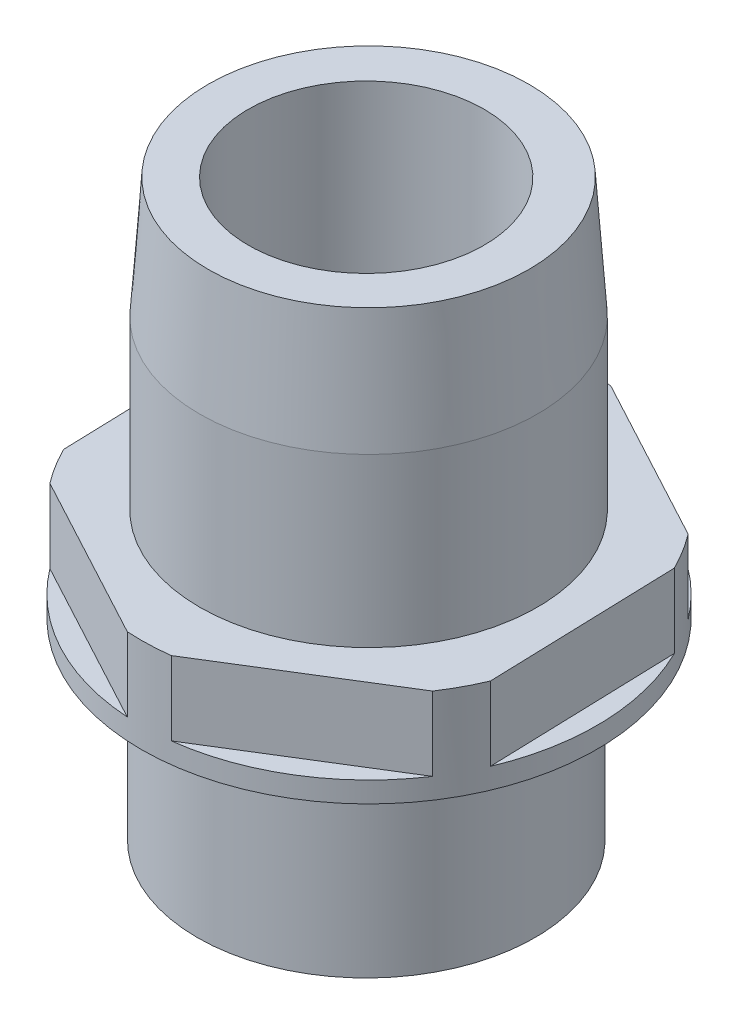
ISO-10303-21;
HEADER;
FILE_DESCRIPTION(('STEP AP214'),'2;1');
FILE_NAME('part.step','',(''),(''),'','','');
FILE_SCHEMA(('AUTOMOTIVE_DESIGN { 1 0 10303 214 1 1 1 1 }'));
ENDSEC;
DATA;
#1=APPLICATION_CONTEXT('core data for automotive mechanical design processes');
#2=APPLICATION_PROTOCOL_DEFINITION('international standard','automotive_design',2000,#1);
#3=PRODUCT_CONTEXT('',#1,'mechanical');
#4=PRODUCT('Part','Part','',(#3));
#5=PRODUCT_RELATED_PRODUCT_CATEGORY('part','',(#4));
#6=PRODUCT_DEFINITION_FORMATION('','',#4);
#7=PRODUCT_DEFINITION_CONTEXT('part definition',#1,'design');
#8=PRODUCT_DEFINITION('design','',#6,#7);
#9=PRODUCT_DEFINITION_SHAPE('','',#8);
#10=(LENGTH_UNIT() NAMED_UNIT(*) SI_UNIT(.MILLI.,.METRE.));
#11=(NAMED_UNIT(*) PLANE_ANGLE_UNIT() SI_UNIT($,.RADIAN.));
#12=(NAMED_UNIT(*) SI_UNIT($,.STERADIAN.) SOLID_ANGLE_UNIT());
#13=UNCERTAINTY_MEASURE_WITH_UNIT(LENGTH_MEASURE(1.E-05),#10,'distance_accuracy_value','');
#14=(GEOMETRIC_REPRESENTATION_CONTEXT(3) GLOBAL_UNCERTAINTY_ASSIGNED_CONTEXT((#13)) GLOBAL_UNIT_ASSIGNED_CONTEXT((#10,
#11,#12)) REPRESENTATION_CONTEXT('',''));
#15=CARTESIAN_POINT('',(0.,0.,0.));
#16=DIRECTION('',(0.,0.,1.));
#17=DIRECTION('',(1.,0.,0.));
#18=AXIS2_PLACEMENT_3D('',#15,#16,#17);
#19=CARTESIAN_POINT('',(-14.328841801714,1.651,-9.16255151509777));
#20=DIRECTION('',(0.,1.,0.));
#21=DIRECTION('',(0.,0.,1.));
#22=AXIS2_PLACEMENT_3D('',#19,#20,#21);
#23=PLANE('',#22);
#24=DIRECTION('',(0.850222544988236,0.,-0.526423426524436));
#25=VECTOR('',#24,1.);
#26=CARTESIAN_POINT('',(-13.7419573430785,1.651,9.89251867541965));
#27=LINE('',#26,#25);
#28=CARTESIAN_POINT('',(-12.0702323694104,1.651,8.85745415727396));
#29=VERTEX_POINT('',#28);
#30=CARTESIAN_POINT('',(0.795050309819294,1.651,0.891791248042038));
#31=VERTEX_POINT('',#30);
#32=EDGE_CURVE('E44',#29,#31,#27,.T.);
#33=ORIENTED_EDGE('',*,*,#32,.F.);
#34=CARTESIAN_POINT('',(-14.328841801714,1.651,-9.16255151509777));
#35=DIRECTION('',(0.,1.,0.));
#36=DIRECTION('',(0.,0.,1.));
#37=AXIS2_PLACEMENT_3D('',#34,#35,#36);
#38=CIRCLE('',#37,18.161);
#39=EDGE_CURVE('E173',#29,#31,#38,.T.);
#40=ORIENTED_EDGE('',*,*,#39,.T.);
#41=EDGE_LOOP('',(#33,#40));
#42=FACE_BOUND('',#41,.T.);
#43=ADVANCED_FACE('F36',(#42),#23,.T.);
#44=DIRECTION('',(0.88100733301153,0.,0.473102609567852));
#45=VECTOR('',#44,1.);
#46=CARTESIAN_POINT('',(-30.5375744282799,1.651,0.873240430425529));
#47=LINE('',#46,#45);
#48=CARTESIAN_POINT('',(-28.8053197741758,1.651,1.80346446669015));
#49=VERTEX_POINT('',#48);
#50=CARTESIAN_POINT('',(-15.4742119971826,1.651,8.96229463915502));
#51=VERTEX_POINT('',#50);
#52=EDGE_CURVE('E168',#49,#51,#47,.T.);
#53=ORIENTED_EDGE('',*,*,#52,.F.);
#54=EDGE_CURVE('E185',#49,#51,#38,.T.);
#55=ORIENTED_EDGE('',*,*,#54,.T.);
#56=EDGE_LOOP('',(#53,#55));
#57=FACE_BOUND('',#56,.T.);
#58=ADVANCED_FACE('F251',(#57),#23,.T.);
#59=DIRECTION('',(0.0307847880232944,0.,0.999526036092288));
#60=VECTOR('',#59,1.);
#61=CARTESIAN_POINT('',(-31.1244588869154,1.651,-18.1818297600919));
#62=LINE('',#61,#60);
#63=CARTESIAN_POINT('',(-31.0639292064794,1.651,-16.2165412056816));
#64=VERTEX_POINT('',#63);
#65=CARTESIAN_POINT('',(-30.5981041087159,1.651,-1.09204812398479));
#66=VERTEX_POINT('',#65);
#67=EDGE_CURVE('E179',#64,#66,#62,.T.);
#68=ORIENTED_EDGE('',*,*,#67,.F.);
#69=EDGE_CURVE('E189',#64,#66,#38,.T.);
#70=ORIENTED_EDGE('',*,*,#69,.T.);
#71=EDGE_LOOP('',(#68,#70));
#72=FACE_BOUND('',#71,.T.);
#73=ADVANCED_FACE('F256',(#72),#23,.T.);
#74=DIRECTION('',(-0.850222544988235,0.,0.526423426524436));
#75=VECTOR('',#74,1.);
#76=CARTESIAN_POINT('',(-14.9157262603494,1.651,-28.2176217056152));
#77=LINE('',#76,#75);
#78=CARTESIAN_POINT('',(-16.5874512340176,1.651,-27.1825571874695));
#79=VERTEX_POINT('',#78);
#80=CARTESIAN_POINT('',(-29.4527339132472,1.651,-19.2168942782376));
#81=VERTEX_POINT('',#80);
#82=EDGE_CURVE('E176',#79,#81,#77,.T.);
#83=ORIENTED_EDGE('',*,*,#82,.F.);
#84=EDGE_CURVE('E194',#79,#81,#38,.T.);
#85=ORIENTED_EDGE('',*,*,#84,.T.);
#86=EDGE_LOOP('',(#83,#85));
#87=FACE_BOUND('',#86,.T.);
#88=ADVANCED_FACE('F267',(#87),#23,.T.);
#89=DIRECTION('',(-0.88100733301153,0.,-0.473102609567852));
#90=VECTOR('',#89,1.);
#91=CARTESIAN_POINT('',(1.87989082485196,1.651,-19.1983434606211));
#92=LINE('',#91,#90);
#93=CARTESIAN_POINT('',(0.147636170747839,1.651,-20.1285674968857));
#94=VERTEX_POINT('',#93);
#95=CARTESIAN_POINT('',(-13.1834716062453,1.651,-27.2873976693506));
#96=VERTEX_POINT('',#95);
#97=EDGE_CURVE('E172',#94,#96,#92,.T.);
#98=ORIENTED_EDGE('',*,*,#97,.F.);
#99=EDGE_CURVE('E199',#94,#96,#38,.T.);
#100=ORIENTED_EDGE('',*,*,#99,.T.);
#101=EDGE_LOOP('',(#98,#100));
#102=FACE_BOUND('',#101,.T.);
#103=ADVANCED_FACE('F260',(#102),#23,.T.);
#104=CARTESIAN_POINT('',(-14.328841801714,1.651,-9.16255151509777));
#105=DIRECTION('',(0.,-1.,0.));
#106=DIRECTION('',(0.,0.,-1.));
#107=AXIS2_PLACEMENT_3D('',#104,#105,#106);
#108=CYLINDRICAL_SURFACE('',#107,18.161);
#109=ORIENTED_EDGE('',*,*,#39,.F.);
#110=DIRECTION('',(0.,1.,0.));
#111=VECTOR('',#110,1.);
#112=CARTESIAN_POINT('',(-12.0702323694104,-0.00100000000000013,8.85745415727396));
#113=LINE('',#112,#111);
#114=CARTESIAN_POINT('',(-12.0702323694104,7.5438,8.85745415727396));
#115=VERTEX_POINT('',#114);
#116=EDGE_CURVE('E234',#29,#115,#113,.T.);
#117=ORIENTED_EDGE('',*,*,#116,.T.);
#118=CARTESIAN_POINT('',(-14.328841801714,7.5438,-9.16255151509777));
#119=DIRECTION('',(0.,-1.,0.));
#120=DIRECTION('',(0.,0.,1.));
#121=AXIS2_PLACEMENT_3D('',#118,#119,#120);
#122=CIRCLE('',#121,18.161);
#123=CARTESIAN_POINT('',(-15.4742119971826,7.5438,8.96229463915502));
#124=VERTEX_POINT('',#123);
#125=EDGE_CURVE('E146',#115,#124,#122,.T.);
#126=ORIENTED_EDGE('',*,*,#125,.T.);
#127=DIRECTION('',(0.,1.,0.));
#128=VECTOR('',#127,1.);
#129=CARTESIAN_POINT('',(-15.4742119971826,-0.00100000000000013,8.96229463915502));
#130=LINE('',#129,#128);
#131=EDGE_CURVE('E229',#51,#124,#130,.T.);
#132=ORIENTED_EDGE('',*,*,#131,.F.);
#133=ORIENTED_EDGE('',*,*,#54,.F.);
#134=DIRECTION('',(0.,1.,0.));
#135=VECTOR('',#134,1.);
#136=CARTESIAN_POINT('',(-28.8053197741758,-0.00100000000000013,1.80346446669015));
#137=LINE('',#136,#135);
#138=CARTESIAN_POINT('',(-28.8053197741758,7.5438,1.80346446669015));
#139=VERTEX_POINT('',#138);
#140=EDGE_CURVE('E228',#49,#139,#137,.T.);
#141=ORIENTED_EDGE('',*,*,#140,.T.);
#142=CARTESIAN_POINT('',(-14.328841801714,7.5438,-9.16255151509777));
#143=DIRECTION('',(0.,-1.,0.));
#144=DIRECTION('',(0.,0.,1.));
#145=AXIS2_PLACEMENT_3D('',#142,#143,#144);
#146=CIRCLE('',#145,18.161);
#147=CARTESIAN_POINT('',(-30.5981041087159,7.5438,-1.09204812398479));
#148=VERTEX_POINT('',#147);
#149=EDGE_CURVE('E226',#139,#148,#146,.T.);
#150=ORIENTED_EDGE('',*,*,#149,.T.);
#151=DIRECTION('',(0.,1.,0.));
#152=VECTOR('',#151,1.);
#153=CARTESIAN_POINT('',(-30.5981041087159,-0.00100000000000013,-1.09204812398479));
#154=LINE('',#153,#152);
#155=EDGE_CURVE('E222',#66,#148,#154,.T.);
#156=ORIENTED_EDGE('',*,*,#155,.F.);
#157=ORIENTED_EDGE('',*,*,#69,.F.);
#158=DIRECTION('',(0.,1.,0.));
#159=VECTOR('',#158,1.);
#160=CARTESIAN_POINT('',(-31.0639292064794,-0.00100000000000013,-16.2165412056816));
#161=LINE('',#160,#159);
#162=CARTESIAN_POINT('',(-31.0639292064794,7.5438,-16.2165412056816));
#163=VERTEX_POINT('',#162);
#164=EDGE_CURVE('E153',#64,#163,#161,.T.);
#165=ORIENTED_EDGE('',*,*,#164,.T.);
#166=CARTESIAN_POINT('',(-14.328841801714,7.5438,-9.16255151509777));
#167=DIRECTION('',(0.,-1.,0.));
#168=DIRECTION('',(0.,0.,1.));
#169=AXIS2_PLACEMENT_3D('',#166,#167,#168);
#170=CIRCLE('',#169,18.161);
#171=CARTESIAN_POINT('',(-29.4527339132472,7.5438,-19.2168942782376));
#172=VERTEX_POINT('',#171);
#173=EDGE_CURVE('E141',#163,#172,#170,.T.);
#174=ORIENTED_EDGE('',*,*,#173,.T.);
#175=DIRECTION('',(0.,1.,0.));
#176=VECTOR('',#175,1.);
#177=CARTESIAN_POINT('',(-29.4527339132472,-0.00100000000000013,-19.2168942782376));
#178=LINE('',#177,#176);
#179=EDGE_CURVE('E148',#81,#172,#178,.T.);
#180=ORIENTED_EDGE('',*,*,#179,.F.);
#181=ORIENTED_EDGE('',*,*,#84,.F.);
#182=DIRECTION('',(0.,1.,0.));
#183=VECTOR('',#182,1.);
#184=CARTESIAN_POINT('',(-16.5874512340176,-0.00100000000000013,-27.1825571874695));
#185=LINE('',#184,#183);
#186=CARTESIAN_POINT('',(-16.5874512340176,7.5438,-27.1825571874695));
#187=VERTEX_POINT('',#186);
#188=EDGE_CURVE('E51',#79,#187,#185,.T.);
#189=ORIENTED_EDGE('',*,*,#188,.T.);
#190=CARTESIAN_POINT('',(-14.328841801714,7.5438,-9.16255151509777));
#191=DIRECTION('',(0.,-1.,0.));
#192=DIRECTION('',(0.,0.,1.));
#193=AXIS2_PLACEMENT_3D('',#190,#191,#192);
#194=CIRCLE('',#193,18.161);
#195=CARTESIAN_POINT('',(-13.1834716062453,7.5438,-27.2873976693506));
#196=VERTEX_POINT('',#195);
#197=EDGE_CURVE('E219',#187,#196,#194,.T.);
#198=ORIENTED_EDGE('',*,*,#197,.T.);
#199=DIRECTION('',(0.,1.,0.));
#200=VECTOR('',#199,1.);
#201=CARTESIAN_POINT('',(-13.1834716062453,-0.00100000000000013,-27.2873976693506));
#202=LINE('',#201,#200);
#203=EDGE_CURVE('E221',#96,#196,#202,.T.);
#204=ORIENTED_EDGE('',*,*,#203,.F.);
#205=ORIENTED_EDGE('',*,*,#99,.F.);
#206=DIRECTION('',(0.,1.,0.));
#207=VECTOR('',#206,1.);
#208=CARTESIAN_POINT('',(0.147636170747839,-0.00100000000000013,-20.1285674968857));
#209=LINE('',#208,#207);
#210=CARTESIAN_POINT('',(0.147636170747848,7.5438,-20.1285674968857));
#211=VERTEX_POINT('',#210);
#212=EDGE_CURVE('E58',#94,#211,#209,.T.);
#213=ORIENTED_EDGE('',*,*,#212,.T.);
#214=CARTESIAN_POINT('',(-14.328841801714,7.5438,-9.16255151509777));
#215=DIRECTION('',(0.,-1.,0.));
#216=DIRECTION('',(0.,0.,1.));
#217=AXIS2_PLACEMENT_3D('',#214,#215,#216);
#218=CIRCLE('',#217,18.161);
#219=CARTESIAN_POINT('',(1.94042050528796,7.5438,-17.2330549062108));
#220=VERTEX_POINT('',#219);
#221=EDGE_CURVE('E215',#211,#220,#218,.T.);
#222=ORIENTED_EDGE('',*,*,#221,.T.);
#223=DIRECTION('',(0.,1.,0.));
#224=VECTOR('',#223,1.);
#225=CARTESIAN_POINT('',(1.94042050528796,-0.00100000000000013,-17.2330549062108));
#226=LINE('',#225,#224);
#227=CARTESIAN_POINT('',(1.94042050528796,1.651,-17.2330549062108));
#228=VERTEX_POINT('',#227);
#229=EDGE_CURVE('E212',#228,#220,#226,.T.);
#230=ORIENTED_EDGE('',*,*,#229,.F.);
#231=CARTESIAN_POINT('',(2.40624560305143,1.651,-2.10856182451398));
#232=VERTEX_POINT('',#231);
#233=EDGE_CURVE('E184',#232,#228,#38,.T.);
#234=ORIENTED_EDGE('',*,*,#233,.F.);
#235=DIRECTION('',(0.,1.,0.));
#236=VECTOR('',#235,1.);
#237=CARTESIAN_POINT('',(2.40624560305143,-0.00100000000000013,-2.10856182451398));
#238=LINE('',#237,#236);
#239=CARTESIAN_POINT('',(2.40624560305142,7.5438,-2.10856182451398));
#240=VERTEX_POINT('',#239);
#241=EDGE_CURVE('E129',#232,#240,#238,.T.);
#242=ORIENTED_EDGE('',*,*,#241,.T.);
#243=CARTESIAN_POINT('',(-14.328841801714,7.5438,-9.16255151509777));
#244=DIRECTION('',(0.,-1.,0.));
#245=DIRECTION('',(0.,0.,1.));
#246=AXIS2_PLACEMENT_3D('',#243,#244,#245);
#247=CIRCLE('',#246,18.161);
#248=CARTESIAN_POINT('',(0.795050309819294,7.5438,0.891791248042038));
#249=VERTEX_POINT('',#248);
#250=EDGE_CURVE('E122',#240,#249,#247,.T.);
#251=ORIENTED_EDGE('',*,*,#250,.T.);
#252=DIRECTION('',(0.,1.,0.));
#253=VECTOR('',#252,1.);
#254=CARTESIAN_POINT('',(0.795050309819294,-0.00100000000000013,0.891791248042038));
#255=LINE('',#254,#253);
#256=EDGE_CURVE('E126',#31,#249,#255,.T.);
#257=ORIENTED_EDGE('',*,*,#256,.F.);
#258=EDGE_LOOP('',(#109,#117,#126,#132,#133,#141,#150,#156,#157,#165,#174,#180,#181,#189,#198,
#204,#205,#213,#222,#230,#234,#242,#251,#257));
#259=FACE_BOUND('',#258,.T.);
#260=CARTESIAN_POINT('',(-14.328841801714,0.,-9.16255151509777));
#261=DIRECTION('',(0.,1.,0.));
#262=DIRECTION('',(0.,0.,1.));
#263=AXIS2_PLACEMENT_3D('',#260,#261,#262);
#264=CIRCLE('',#263,18.161);
#265=CARTESIAN_POINT('',(-14.328841801714,0.,8.99844848490223));
#266=VERTEX_POINT('',#265);
#267=EDGE_CURVE('E166',#266,#266,#264,.T.);
#268=ORIENTED_EDGE('',*,*,#267,.T.);
#269=EDGE_LOOP('',(#268));
#270=FACE_BOUND('',#269,.T.);
#271=ADVANCED_FACE('F38',(#259,#270),#108,.T.);
#272=DIRECTION('',(-0.0307847880232945,0.,-0.999526036092288));
#273=VECTOR('',#272,1.);
#274=CARTESIAN_POINT('',(2.46677528348742,1.651,-0.143273270103649));
#275=LINE('',#274,#273);
#276=EDGE_CURVE('E169',#232,#228,#275,.T.);
#277=ORIENTED_EDGE('',*,*,#276,.F.);
#278=ORIENTED_EDGE('',*,*,#233,.T.);
#279=EDGE_LOOP('',(#277,#278));
#280=FACE_BOUND('',#279,.T.);
#281=ADVANCED_FACE('F208',(#280),#23,.T.);
#282=CARTESIAN_POINT('',(-14.328841801714,0.,-9.16255151509777));
#283=DIRECTION('',(0.,1.,0.));
#284=DIRECTION('',(0.,0.,1.));
#285=AXIS2_PLACEMENT_3D('',#282,#283,#284);
#286=PLANE('',#285);
#287=CARTESIAN_POINT('',(-14.3394201503924,0.,-8.95073522414691));
#288=DIRECTION('',(0.,1.,0.));
#289=DIRECTION('',(0.,0.,1.));
#290=AXIS2_PLACEMENT_3D('',#287,#288,#289);
#291=CIRCLE('',#290,13.462);
#292=CARTESIAN_POINT('',(-14.3394201503924,0.,4.51126477585309));
#293=VERTEX_POINT('',#292);
#294=EDGE_CURVE('E11',#293,#293,#291,.F.);
#295=ORIENTED_EDGE('',*,*,#294,.F.);
#296=EDGE_LOOP('',(#295));
#297=FACE_BOUND('',#296,.T.);
#298=ORIENTED_EDGE('',*,*,#267,.F.);
#299=EDGE_LOOP('',(#298));
#300=FACE_BOUND('',#299,.T.);
#301=ADVANCED_FACE('F259',(#297,#300),#286,.F.);
#302=CARTESIAN_POINT('',(-13.7419573430785,7.5438,9.89251867541965));
#303=DIRECTION('',(-0.526423426524436,0.,-0.850222544988236));
#304=DIRECTION('',(-0.850222544988236,0.,0.526423426524436));
#305=AXIS2_PLACEMENT_3D('',#302,#303,#304);
#306=PLANE('',#305);
#307=ORIENTED_EDGE('',*,*,#32,.T.);
#308=ORIENTED_EDGE('',*,*,#256,.T.);
#309=DIRECTION('',(0.850222544988236,0.,-0.526423426524436));
#310=VECTOR('',#309,1.);
#311=CARTESIAN_POINT('',(-13.7419573430785,7.5438,9.89251867541965));
#312=LINE('',#311,#310);
#313=EDGE_CURVE('E139',#115,#249,#312,.T.);
#314=ORIENTED_EDGE('',*,*,#313,.F.);
#315=ORIENTED_EDGE('',*,*,#116,.F.);
#316=EDGE_LOOP('',(#307,#308,#314,#315));
#317=FACE_BOUND('',#316,.T.);
#318=ADVANCED_FACE('F138',(#317),#306,.F.);
#319=CARTESIAN_POINT('',(2.46677528348742,7.5438,-0.143273270103649));
#320=DIRECTION('',(-0.999526036092288,0.,0.0307847880232945));
#321=DIRECTION('',(0.0307847880232945,0.,0.999526036092288));
#322=AXIS2_PLACEMENT_3D('',#319,#320,#321);
#323=PLANE('',#322);
#324=DIRECTION('',(-0.0307847880232945,0.,-0.999526036092288));
#325=VECTOR('',#324,1.);
#326=CARTESIAN_POINT('',(2.46677528348742,7.5438,-0.143273270103649));
#327=LINE('',#326,#325);
#328=EDGE_CURVE('E147',#240,#220,#327,.T.);
#329=ORIENTED_EDGE('',*,*,#328,.F.);
#330=ORIENTED_EDGE('',*,*,#241,.F.);
#331=ORIENTED_EDGE('',*,*,#276,.T.);
#332=ORIENTED_EDGE('',*,*,#229,.T.);
#333=EDGE_LOOP('',(#329,#330,#331,#332));
#334=FACE_BOUND('',#333,.T.);
#335=ADVANCED_FACE('F211',(#334),#323,.F.);
#336=CARTESIAN_POINT('',(1.87989082485196,7.5438,-19.1983434606211));
#337=DIRECTION('',(-0.473102609567852,0.,0.88100733301153));
#338=DIRECTION('',(0.88100733301153,0.,0.473102609567852));
#339=AXIS2_PLACEMENT_3D('',#336,#337,#338);
#340=PLANE('',#339);
#341=DIRECTION('',(-0.88100733301153,0.,-0.473102609567852));
#342=VECTOR('',#341,1.);
#343=CARTESIAN_POINT('',(1.87989082485196,7.5438,-19.1983434606211));
#344=LINE('',#343,#342);
#345=EDGE_CURVE('E150',#211,#196,#344,.T.);
#346=ORIENTED_EDGE('',*,*,#345,.F.);
#347=ORIENTED_EDGE('',*,*,#212,.F.);
#348=ORIENTED_EDGE('',*,*,#97,.T.);
#349=ORIENTED_EDGE('',*,*,#203,.T.);
#350=EDGE_LOOP('',(#346,#347,#348,#349));
#351=FACE_BOUND('',#350,.T.);
#352=ADVANCED_FACE('F273',(#351),#340,.F.);
#353=CARTESIAN_POINT('',(-14.9157262603494,7.5438,-28.2176217056152));
#354=DIRECTION('',(0.526423426524436,0.,0.850222544988236));
#355=DIRECTION('',(0.850222544988236,0.,-0.526423426524436));
#356=AXIS2_PLACEMENT_3D('',#353,#354,#355);
#357=PLANE('',#356);
#358=DIRECTION('',(-0.850222544988235,0.,0.526423426524436));
#359=VECTOR('',#358,1.);
#360=CARTESIAN_POINT('',(-14.9157262603494,7.5438,-28.2176217056152));
#361=LINE('',#360,#359);
#362=EDGE_CURVE('E159',#187,#172,#361,.T.);
#363=ORIENTED_EDGE('',*,*,#362,.F.);
#364=ORIENTED_EDGE('',*,*,#188,.F.);
#365=ORIENTED_EDGE('',*,*,#82,.T.);
#366=ORIENTED_EDGE('',*,*,#179,.T.);
#367=EDGE_LOOP('',(#363,#364,#365,#366));
#368=FACE_BOUND('',#367,.T.);
#369=ADVANCED_FACE('F275',(#368),#357,.F.);
#370=CARTESIAN_POINT('',(-31.1244588869154,7.5438,-18.1818297600919));
#371=DIRECTION('',(0.999526036092288,0.,-0.0307847880232944));
#372=DIRECTION('',(-0.0307847880232944,0.,-0.999526036092288));
#373=AXIS2_PLACEMENT_3D('',#370,#371,#372);
#374=PLANE('',#373);
#375=ORIENTED_EDGE('',*,*,#67,.T.);
#376=ORIENTED_EDGE('',*,*,#155,.T.);
#377=DIRECTION('',(0.0307847880232944,0.,0.999526036092288));
#378=VECTOR('',#377,1.);
#379=CARTESIAN_POINT('',(-31.1244588869154,7.5438,-18.1818297600919));
#380=LINE('',#379,#378);
#381=EDGE_CURVE('E161',#163,#148,#380,.T.);
#382=ORIENTED_EDGE('',*,*,#381,.F.);
#383=ORIENTED_EDGE('',*,*,#164,.F.);
#384=EDGE_LOOP('',(#375,#376,#382,#383));
#385=FACE_BOUND('',#384,.T.);
#386=ADVANCED_FACE('F245',(#385),#374,.F.);
#387=CARTESIAN_POINT('',(-30.5375744282799,7.5438,0.873240430425529));
#388=DIRECTION('',(0.473102609567852,0.,-0.88100733301153));
#389=DIRECTION('',(-0.88100733301153,0.,-0.473102609567852));
#390=AXIS2_PLACEMENT_3D('',#387,#388,#389);
#391=PLANE('',#390);
#392=DIRECTION('',(0.88100733301153,0.,0.473102609567852));
#393=VECTOR('',#392,1.);
#394=CARTESIAN_POINT('',(-30.5375744282799,7.5438,0.873240430425529));
#395=LINE('',#394,#393);
#396=EDGE_CURVE('E164',#139,#124,#395,.T.);
#397=ORIENTED_EDGE('',*,*,#396,.F.);
#398=ORIENTED_EDGE('',*,*,#140,.F.);
#399=ORIENTED_EDGE('',*,*,#52,.T.);
#400=ORIENTED_EDGE('',*,*,#131,.T.);
#401=EDGE_LOOP('',(#397,#398,#399,#400));
#402=FACE_BOUND('',#401,.T.);
#403=ADVANCED_FACE('F248',(#402),#391,.F.);
#404=CARTESIAN_POINT('',(0.,7.5438,0.));
#405=DIRECTION('',(0.,1.,0.));
#406=DIRECTION('',(0.,0.,1.));
#407=AXIS2_PLACEMENT_3D('',#404,#405,#406);
#408=PLANE('',#407);
#409=CARTESIAN_POINT('',(-14.2739017730092,7.5438,-9.07381828501432));
#410=DIRECTION('',(0.,1.,0.));
#411=DIRECTION('',(0.,0.,1.));
#412=AXIS2_PLACEMENT_3D('',#409,#410,#411);
#413=CIRCLE('',#412,13.462);
#414=CARTESIAN_POINT('',(-14.2739017730092,7.5438,4.38818171498568));
#415=VERTEX_POINT('',#414);
#416=EDGE_CURVE('E511',#415,#415,#413,.T.);
#417=ORIENTED_EDGE('',*,*,#416,.F.);
#418=EDGE_LOOP('',(#417));
#419=FACE_BOUND('',#418,.T.);
#420=ORIENTED_EDGE('',*,*,#250,.F.);
#421=ORIENTED_EDGE('',*,*,#328,.T.);
#422=ORIENTED_EDGE('',*,*,#221,.F.);
#423=ORIENTED_EDGE('',*,*,#345,.T.);
#424=ORIENTED_EDGE('',*,*,#197,.F.);
#425=ORIENTED_EDGE('',*,*,#362,.T.);
#426=ORIENTED_EDGE('',*,*,#173,.F.);
#427=ORIENTED_EDGE('',*,*,#381,.T.);
#428=ORIENTED_EDGE('',*,*,#149,.F.);
#429=ORIENTED_EDGE('',*,*,#396,.T.);
#430=ORIENTED_EDGE('',*,*,#125,.F.);
#431=ORIENTED_EDGE('',*,*,#313,.T.);
#432=EDGE_LOOP('',(#420,#421,#422,#423,#424,#425,#426,#427,#428,#429,#430,#431));
#433=FACE_BOUND('',#432,.T.);
#434=ADVANCED_FACE('F144',(#419,#433),#408,.T.);
#435=CARTESIAN_POINT('',(-14.2739017730092,20.8788,-9.07381828501432));
#436=DIRECTION('',(0.,-1.,0.));
#437=DIRECTION('',(0.,0.,-1.));
#438=AXIS2_PLACEMENT_3D('',#435,#436,#437);
#439=CYLINDRICAL_SURFACE('',#438,13.462);
#440=CARTESIAN_POINT('',(-14.2739017730092,20.8788,-9.07381828501432));
#441=DIRECTION('',(0.,1.,0.));
#442=DIRECTION('',(0.,0.,1.));
#443=AXIS2_PLACEMENT_3D('',#440,#441,#442);
#444=CIRCLE('',#443,13.462);
#445=CARTESIAN_POINT('',(-14.2739017730092,20.8788,4.38818171498568));
#446=VERTEX_POINT('',#445);
#447=EDGE_CURVE('E235',#446,#446,#444,.T.);
#448=ORIENTED_EDGE('',*,*,#447,.F.);
#449=EDGE_LOOP('',(#448));
#450=FACE_BOUND('',#449,.T.);
#451=ORIENTED_EDGE('',*,*,#416,.T.);
#452=EDGE_LOOP('',(#451));
#453=FACE_BOUND('',#452,.T.);
#454=ADVANCED_FACE('F326',(#450,#453),#439,.T.);
#455=CARTESIAN_POINT('',(-14.2739017730092,20.8788,-9.07381828501432));
#456=DIRECTION('',(0.,-1.,0.));
#457=DIRECTION('',(0.,0.,1.));
#458=AXIS2_PLACEMENT_3D('',#455,#456,#457);
#459=CONICAL_SURFACE('',#458,13.462,0.0698131700797732);
#460=CARTESIAN_POINT('',(-14.2739017730092,30.5308,-9.07381828501432));
#461=DIRECTION('',(0.,1.,0.));
#462=DIRECTION('',(0.,0.,1.));
#463=AXIS2_PLACEMENT_3D('',#460,#461,#462);
#464=CIRCLE('',#463,12.7870664111212);
#465=CARTESIAN_POINT('',(-14.2739017730092,30.5308,3.71324812610691));
#466=VERTEX_POINT('',#465);
#467=EDGE_CURVE('E508',#466,#466,#464,.T.);
#468=ORIENTED_EDGE('',*,*,#467,.F.);
#469=EDGE_LOOP('',(#468));
#470=FACE_BOUND('',#469,.T.);
#471=ORIENTED_EDGE('',*,*,#447,.T.);
#472=EDGE_LOOP('',(#471));
#473=FACE_BOUND('',#472,.T.);
#474=ADVANCED_FACE('F338',(#470,#473),#459,.T.);
#475=CARTESIAN_POINT('',(-14.2739017730092,30.5308,-9.07381828501432));
#476=DIRECTION('',(0.,1.,0.));
#477=DIRECTION('',(0.,0.,1.));
#478=AXIS2_PLACEMENT_3D('',#475,#476,#477);
#479=PLANE('',#478);
#480=CARTESIAN_POINT('',(-14.3394201503924,30.5308,-8.95073522414691));
#481=DIRECTION('',(0.,-1.,0.));
#482=DIRECTION('',(0.,0.,-1.));
#483=AXIS2_PLACEMENT_3D('',#480,#481,#482);
#484=CIRCLE('',#483,9.398);
#485=CARTESIAN_POINT('',(-14.3394201503924,30.5308,-18.3487352241469));
#486=VERTEX_POINT('',#485);
#487=EDGE_CURVE('E498',#486,#486,#484,.T.);
#488=ORIENTED_EDGE('',*,*,#487,.T.);
#489=EDGE_LOOP('',(#488));
#490=FACE_BOUND('',#489,.T.);
#491=ORIENTED_EDGE('',*,*,#467,.T.);
#492=EDGE_LOOP('',(#491));
#493=FACE_BOUND('',#492,.T.);
#494=ADVANCED_FACE('F349',(#490,#493),#479,.T.);
#495=CARTESIAN_POINT('',(-14.3394201503924,-15.24,-8.95073522414691));
#496=DIRECTION('',(0.,1.,0.));
#497=DIRECTION('',(0.,0.,1.));
#498=AXIS2_PLACEMENT_3D('',#495,#496,#497);
#499=CYLINDRICAL_SURFACE('',#498,13.462);
#500=CARTESIAN_POINT('',(-14.3394201503924,-15.24,-8.95073522414691));
#501=DIRECTION('',(0.,-1.,0.));
#502=DIRECTION('',(0.,0.,-1.));
#503=AXIS2_PLACEMENT_3D('',#500,#501,#502);
#504=CIRCLE('',#503,13.462);
#505=CARTESIAN_POINT('',(-14.3394201503924,-15.24,4.51126477585309));
#506=VERTEX_POINT('',#505);
#507=EDGE_CURVE('E503',#506,#506,#504,.T.);
#508=CARTESIAN_POINT('',(-14.3394201503924,-15.24,4.51126477585309));
#509=CARTESIAN_POINT('',(-14.3394201503924,-15.08125,4.51126477585309));
#510=CARTESIAN_POINT('',(-14.3394201503924,-14.9225,4.51126477585309));
#511=CARTESIAN_POINT('',(-14.3394201503924,-14.605,4.51126477585309));
#512=CARTESIAN_POINT('',(-14.3394201503924,-14.44625,4.51126477585309));
#513=CARTESIAN_POINT('',(-14.3394201503924,-14.12875,4.51126477585309));
#514=CARTESIAN_POINT('',(-14.3394201503924,-13.97,4.51126477585309));
#515=CARTESIAN_POINT('',(-14.3394201503924,-13.6525,4.51126477585309));
#516=CARTESIAN_POINT('',(-14.3394201503924,-13.49375,4.51126477585309));
#517=CARTESIAN_POINT('',(-14.3394201503924,-13.17625,4.51126477585309));
#518=CARTESIAN_POINT('',(-14.3394201503924,-13.0175,4.51126477585309));
#519=CARTESIAN_POINT('',(-14.3394201503924,-12.7,4.51126477585309));
#520=CARTESIAN_POINT('',(-14.3394201503924,-12.54125,4.51126477585309));
#521=CARTESIAN_POINT('',(-14.3394201503924,-12.22375,4.51126477585309));
#522=CARTESIAN_POINT('',(-14.3394201503924,-12.065,4.51126477585309));
#523=CARTESIAN_POINT('',(-14.3394201503924,-11.7475,4.51126477585309));
#524=CARTESIAN_POINT('',(-14.3394201503924,-11.58875,4.51126477585309));
#525=CARTESIAN_POINT('',(-14.3394201503924,-11.27125,4.51126477585309));
#526=CARTESIAN_POINT('',(-14.3394201503924,-11.1125,4.51126477585309));
#527=CARTESIAN_POINT('',(-14.3394201503924,-10.795,4.51126477585309));
#528=CARTESIAN_POINT('',(-14.3394201503924,-10.63625,4.51126477585309));
#529=CARTESIAN_POINT('',(-14.3394201503924,-10.31875,4.51126477585309));
#530=CARTESIAN_POINT('',(-14.3394201503924,-10.16,4.51126477585309));
#531=CARTESIAN_POINT('',(-14.3394201503924,-9.8425,4.51126477585309));
#532=CARTESIAN_POINT('',(-14.3394201503924,-9.68375,4.51126477585309));
#533=CARTESIAN_POINT('',(-14.3394201503924,-9.36625,4.51126477585309));
#534=CARTESIAN_POINT('',(-14.3394201503924,-9.2075,4.51126477585309));
#535=CARTESIAN_POINT('',(-14.3394201503924,-8.89,4.51126477585309));
#536=CARTESIAN_POINT('',(-14.3394201503924,-8.73125,4.51126477585309));
#537=CARTESIAN_POINT('',(-14.3394201503924,-8.41375,4.51126477585309));
#538=CARTESIAN_POINT('',(-14.3394201503924,-8.255,4.51126477585309));
#539=CARTESIAN_POINT('',(-14.3394201503924,-7.9375,4.51126477585309));
#540=CARTESIAN_POINT('',(-14.3394201503924,-7.77875,4.51126477585309));
#541=CARTESIAN_POINT('',(-14.3394201503924,-7.46125,4.51126477585309));
#542=CARTESIAN_POINT('',(-14.3394201503924,-7.3025,4.51126477585309));
#543=CARTESIAN_POINT('',(-14.3394201503924,-6.985,4.51126477585309));
#544=CARTESIAN_POINT('',(-14.3394201503924,-6.82625,4.51126477585309));
#545=CARTESIAN_POINT('',(-14.3394201503924,-6.50875,4.51126477585309));
#546=CARTESIAN_POINT('',(-14.3394201503924,-6.35,4.51126477585309));
#547=CARTESIAN_POINT('',(-14.3394201503924,-6.0325,4.51126477585309));
#548=CARTESIAN_POINT('',(-14.3394201503924,-5.87375,4.51126477585309));
#549=CARTESIAN_POINT('',(-14.3394201503924,-5.55625,4.51126477585309));
#550=CARTESIAN_POINT('',(-14.3394201503924,-5.3975,4.51126477585309));
#551=CARTESIAN_POINT('',(-14.3394201503924,-5.08,4.51126477585309));
#552=CARTESIAN_POINT('',(-14.3394201503924,-4.92125,4.51126477585309));
#553=CARTESIAN_POINT('',(-14.3394201503924,-4.60375,4.51126477585309));
#554=CARTESIAN_POINT('',(-14.3394201503924,-4.445,4.51126477585309));
#555=CARTESIAN_POINT('',(-14.3394201503924,-4.1275,4.51126477585309));
#556=CARTESIAN_POINT('',(-14.3394201503924,-3.96875,4.51126477585309));
#557=CARTESIAN_POINT('',(-14.3394201503924,-3.65125,4.51126477585309));
#558=CARTESIAN_POINT('',(-14.3394201503924,-3.4925,4.51126477585309));
#559=CARTESIAN_POINT('',(-14.3394201503924,-3.175,4.51126477585309));
#560=CARTESIAN_POINT('',(-14.3394201503924,-3.01625,4.51126477585309));
#561=CARTESIAN_POINT('',(-14.3394201503924,-2.69875,4.51126477585309));
#562=CARTESIAN_POINT('',(-14.3394201503924,-2.54,4.51126477585309));
#563=CARTESIAN_POINT('',(-14.3394201503924,-2.2225,4.51126477585309));
#564=CARTESIAN_POINT('',(-14.3394201503924,-2.06375,4.51126477585309));
#565=CARTESIAN_POINT('',(-14.3394201503924,-1.74625,4.51126477585309));
#566=CARTESIAN_POINT('',(-14.3394201503924,-1.5875,4.51126477585309));
#567=CARTESIAN_POINT('',(-14.3394201503924,-1.27,4.51126477585309));
#568=CARTESIAN_POINT('',(-14.3394201503924,-1.11125,4.51126477585309));
#569=CARTESIAN_POINT('',(-14.3394201503924,-0.79375,4.51126477585309));
#570=CARTESIAN_POINT('',(-14.3394201503924,-0.634999999999999,4.51126477585309));
#571=CARTESIAN_POINT('',(-14.3394201503924,-0.3175,4.51126477585309));
#572=CARTESIAN_POINT('',(-14.3394201503924,-0.15875,4.51126477585309));
#573=CARTESIAN_POINT('',(-14.3394201503924,0.,4.51126477585309));
#574=B_SPLINE_CURVE_WITH_KNOTS('',3,(#508,#509,#510,#511,#512,#513,#514,#515,#516,#517,#518,
#519,#520,#521,#522,#523,#524,#525,#526,#527,#528,#529,#530,#531,#532,#533,#534,#535,#536,#537,
#538,#539,#540,#541,#542,#543,#544,#545,#546,#547,#548,#549,#550,#551,#552,#553,#554,#555,#556,
#557,#558,#559,#560,#561,#562,#563,#564,#565,#566,#567,#568,#569,#570,#571,#572,#573),
.UNSPECIFIED.,.F.,.F.,(4,2,2,2,2,2,2,2,2,2,2,2,2,2,2,2,2,2,2,2,2,2,2,2,2,2,2,2,2,2,2,2,4),(0.,
0.476249999999999,0.952499999999998,1.42875,1.905,2.38125,2.8575,3.33375,3.81,4.28625,4.7625,
5.23875,5.715,6.19125,6.6675,7.14375,7.62,8.09625,8.5725,9.04875,9.525,10.00125,10.4775,
10.95375,11.43,11.90625,12.3825,12.85875,13.335,13.81125,14.2875,14.76375,15.24),.UNSPECIFIED.);
#575=EDGE_CURVE('BSEAM364',#506,#293,#574,.T.);
#576=ORIENTED_EDGE('',*,*,#507,.F.);
#577=ORIENTED_EDGE('',*,*,#294,.T.);
#578=ORIENTED_EDGE('',*,*,#575,.T.);
#579=ORIENTED_EDGE('',*,*,#575,.F.);
#580=EDGE_LOOP('',(#576,#578,#577,#579));
#581=FACE_BOUND('',#580,.T.);
#582=ADVANCED_FACE('F364',(#581),#499,.T.);
#583=CARTESIAN_POINT('',(-14.3394201503924,-15.24,-8.95073522414691));
#584=DIRECTION('',(0.,-1.,0.));
#585=DIRECTION('',(0.,0.,-1.));
#586=AXIS2_PLACEMENT_3D('',#583,#584,#585);
#587=PLANE('',#586);
#588=CARTESIAN_POINT('',(-14.3394201503924,-15.24,-8.95073522414691));
#589=DIRECTION('',(0.,-1.,0.));
#590=DIRECTION('',(0.,0.,-1.));
#591=AXIS2_PLACEMENT_3D('',#588,#589,#590);
#592=CIRCLE('',#591,9.398);
#593=CARTESIAN_POINT('',(-14.3394201503924,-15.24,-18.3487352241469));
#594=VERTEX_POINT('',#593);
#595=EDGE_CURVE('E501',#594,#594,#592,.T.);
#596=ORIENTED_EDGE('',*,*,#595,.F.);
#597=EDGE_LOOP('',(#596));
#598=FACE_BOUND('',#597,.T.);
#599=ORIENTED_EDGE('',*,*,#507,.T.);
#600=EDGE_LOOP('',(#599));
#601=FACE_BOUND('',#600,.T.);
#602=ADVANCED_FACE('F370',(#598,#601),#587,.T.);
#603=CARTESIAN_POINT('',(-14.3394201503924,30.5308,-8.95073522414691));
#604=DIRECTION('',(0.,-1.,0.));
#605=DIRECTION('',(0.,0.,-1.));
#606=AXIS2_PLACEMENT_3D('',#603,#604,#605);
#607=CYLINDRICAL_SURFACE('',#606,9.398);
#608=CARTESIAN_POINT('',(-14.3394201503924,30.5308,-18.3487352241469));
#609=CARTESIAN_POINT('',(-14.3394201503924,30.0540208333333,-18.3487352241469));
#610=CARTESIAN_POINT('',(-14.3394201503924,29.5772416666667,-18.3487352241469));
#611=CARTESIAN_POINT('',(-14.3394201503924,28.6236833333333,-18.3487352241469));
#612=CARTESIAN_POINT('',(-14.3394201503924,28.1469041666667,-18.3487352241469));
#613=CARTESIAN_POINT('',(-14.3394201503924,27.1933458333333,-18.3487352241469));
#614=CARTESIAN_POINT('',(-14.3394201503924,26.7165666666667,-18.3487352241469));
#615=CARTESIAN_POINT('',(-14.3394201503924,25.7630083333333,-18.3487352241469));
#616=CARTESIAN_POINT('',(-14.3394201503924,25.2862291666667,-18.3487352241469));
#617=CARTESIAN_POINT('',(-14.3394201503924,24.3326708333333,-18.3487352241469));
#618=CARTESIAN_POINT('',(-14.3394201503924,23.8558916666667,-18.3487352241469));
#619=CARTESIAN_POINT('',(-14.3394201503924,22.9023333333333,-18.3487352241469));
#620=CARTESIAN_POINT('',(-14.3394201503924,22.4255541666667,-18.3487352241469));
#621=CARTESIAN_POINT('',(-14.3394201503924,21.4719958333333,-18.3487352241469));
#622=CARTESIAN_POINT('',(-14.3394201503924,20.9952166666667,-18.3487352241469));
#623=CARTESIAN_POINT('',(-14.3394201503924,20.0416583333333,-18.3487352241469));
#624=CARTESIAN_POINT('',(-14.3394201503924,19.5648791666667,-18.3487352241469));
#625=CARTESIAN_POINT('',(-14.3394201503924,18.6113208333333,-18.3487352241469));
#626=CARTESIAN_POINT('',(-14.3394201503924,18.1345416666667,-18.3487352241469));
#627=CARTESIAN_POINT('',(-14.3394201503924,17.1809833333333,-18.3487352241469));
#628=CARTESIAN_POINT('',(-14.3394201503924,16.7042041666667,-18.3487352241469));
#629=CARTESIAN_POINT('',(-14.3394201503924,15.7506458333333,-18.3487352241469));
#630=CARTESIAN_POINT('',(-14.3394201503924,15.2738666666667,-18.3487352241469));
#631=CARTESIAN_POINT('',(-14.3394201503924,14.3203083333333,-18.3487352241469));
#632=CARTESIAN_POINT('',(-14.3394201503924,13.8435291666667,-18.3487352241469));
#633=CARTESIAN_POINT('',(-14.3394201503924,12.8899708333333,-18.3487352241469));
#634=CARTESIAN_POINT('',(-14.3394201503924,12.4131916666667,-18.3487352241469));
#635=CARTESIAN_POINT('',(-14.3394201503924,11.4596333333333,-18.3487352241469));
#636=CARTESIAN_POINT('',(-14.3394201503924,10.9828541666667,-18.3487352241469));
#637=CARTESIAN_POINT('',(-14.3394201503924,10.0292958333333,-18.3487352241469));
#638=CARTESIAN_POINT('',(-14.3394201503924,9.55251666666667,-18.3487352241469));
#639=CARTESIAN_POINT('',(-14.3394201503924,8.59895833333334,-18.3487352241469));
#640=CARTESIAN_POINT('',(-14.3394201503924,8.12217916666667,-18.3487352241469));
#641=CARTESIAN_POINT('',(-14.3394201503924,7.16862083333334,-18.3487352241469));
#642=CARTESIAN_POINT('',(-14.3394201503924,6.69184166666667,-18.3487352241469));
#643=CARTESIAN_POINT('',(-14.3394201503924,5.73828333333334,-18.3487352241469));
#644=CARTESIAN_POINT('',(-14.3394201503924,5.26150416666667,-18.3487352241469));
#645=CARTESIAN_POINT('',(-14.3394201503924,4.30794583333334,-18.3487352241469));
#646=CARTESIAN_POINT('',(-14.3394201503924,3.83116666666667,-18.3487352241469));
#647=CARTESIAN_POINT('',(-14.3394201503924,2.87760833333334,-18.3487352241469));
#648=CARTESIAN_POINT('',(-14.3394201503924,2.40082916666667,-18.3487352241469));
#649=CARTESIAN_POINT('',(-14.3394201503924,1.44727083333334,-18.3487352241469));
#650=CARTESIAN_POINT('',(-14.3394201503924,0.97049166666667,-18.3487352241469));
#651=CARTESIAN_POINT('',(-14.3394201503924,0.0169333333333369,-18.3487352241469));
#652=CARTESIAN_POINT('',(-14.3394201503924,-0.45984583333333,-18.3487352241469));
#653=CARTESIAN_POINT('',(-14.3394201503924,-1.41340416666666,-18.3487352241469));
#654=CARTESIAN_POINT('',(-14.3394201503924,-1.89018333333333,-18.3487352241469));
#655=CARTESIAN_POINT('',(-14.3394201503924,-2.84374166666666,-18.3487352241469));
#656=CARTESIAN_POINT('',(-14.3394201503924,-3.32052083333333,-18.3487352241469));
#657=CARTESIAN_POINT('',(-14.3394201503924,-4.27407916666666,-18.3487352241469));
#658=CARTESIAN_POINT('',(-14.3394201503924,-4.75085833333333,-18.3487352241469));
#659=CARTESIAN_POINT('',(-14.3394201503924,-5.70441666666667,-18.3487352241469));
#660=CARTESIAN_POINT('',(-14.3394201503924,-6.18119583333333,-18.3487352241469));
#661=CARTESIAN_POINT('',(-14.3394201503924,-7.13475416666666,-18.3487352241469));
#662=CARTESIAN_POINT('',(-14.3394201503924,-7.61153333333333,-18.3487352241469));
#663=CARTESIAN_POINT('',(-14.3394201503924,-8.56509166666666,-18.3487352241469));
#664=CARTESIAN_POINT('',(-14.3394201503924,-9.04187083333333,-18.3487352241469));
#665=CARTESIAN_POINT('',(-14.3394201503924,-9.99542916666666,-18.3487352241469));
#666=CARTESIAN_POINT('',(-14.3394201503924,-10.4722083333333,-18.3487352241469));
#667=CARTESIAN_POINT('',(-14.3394201503924,-11.4257666666667,-18.3487352241469));
#668=CARTESIAN_POINT('',(-14.3394201503924,-11.9025458333333,-18.3487352241469));
#669=CARTESIAN_POINT('',(-14.3394201503924,-12.8561041666667,-18.3487352241469));
#670=CARTESIAN_POINT('',(-14.3394201503924,-13.3328833333333,-18.3487352241469));
#671=CARTESIAN_POINT('',(-14.3394201503924,-14.2864416666667,-18.3487352241469));
#672=CARTESIAN_POINT('',(-14.3394201503924,-14.7632208333333,-18.3487352241469));
#673=CARTESIAN_POINT('',(-14.3394201503924,-15.24,-18.3487352241469));
#674=B_SPLINE_CURVE_WITH_KNOTS('',3,(#608,#609,#610,#611,#612,#613,#614,#615,#616,#617,#618,
#619,#620,#621,#622,#623,#624,#625,#626,#627,#628,#629,#630,#631,#632,#633,#634,#635,#636,#637,
#638,#639,#640,#641,#642,#643,#644,#645,#646,#647,#648,#649,#650,#651,#652,#653,#654,#655,#656,
#657,#658,#659,#660,#661,#662,#663,#664,#665,#666,#667,#668,#669,#670,#671,#672,#673),
.UNSPECIFIED.,.F.,.F.,(4,2,2,2,2,2,2,2,2,2,2,2,2,2,2,2,2,2,2,2,2,2,2,2,2,2,2,2,2,2,2,2,4),(0.,
1.4303375,2.860675,4.2910125,5.72135,7.1516875,8.582025,10.0123625,11.4427,12.8730375,14.303375,
15.7337125,17.16405,18.5943875,20.024725,21.4550625,22.8854,24.3157375,25.746075,27.1764125,
28.60675,30.0370875,31.467425,32.8977625,34.3281,35.7584375,37.188775,38.6191125,40.04945,
41.4797875,42.910125,44.3404625,45.7708),.UNSPECIFIED.);
#675=EDGE_CURVE('BSEAM389',#486,#594,#674,.T.);
#676=ORIENTED_EDGE('',*,*,#487,.F.);
#677=ORIENTED_EDGE('',*,*,#595,.T.);
#678=ORIENTED_EDGE('',*,*,#675,.T.);
#679=ORIENTED_EDGE('',*,*,#675,.F.);
#680=EDGE_LOOP('',(#676,#678,#677,#679));
#681=FACE_BOUND('',#680,.T.);
#682=ADVANCED_FACE('F389',(#681),#607,.F.);
#683=CLOSED_SHELL('',(#43,#58,#73,#88,#103,#271,#281,#301,#318,#335,#352,#369,#386,#403,#434,
#454,#474,#494,#582,#602,#682));
#684=MANIFOLD_SOLID_BREP('B2',#683);
#685=ADVANCED_BREP_SHAPE_REPRESENTATION('',(#18,#684),#14);
#686=SHAPE_DEFINITION_REPRESENTATION(#9,#685);
ENDSEC;
END-ISO-10303-21;
